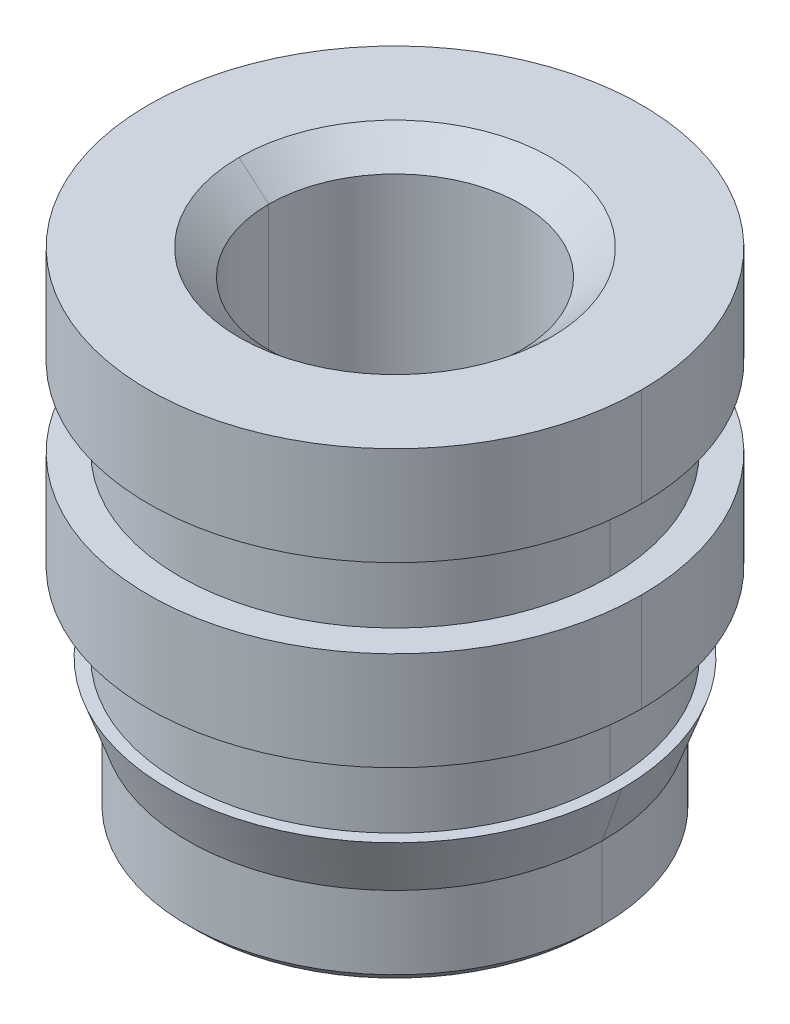
ISO-10303-21;
HEADER;
FILE_DESCRIPTION(('STEP AP214'),'2;1');
FILE_NAME('part.step','',(''),(''),'','','');
FILE_SCHEMA(('AUTOMOTIVE_DESIGN { 1 0 10303 214 1 1 1 1 }'));
ENDSEC;
DATA;
#1=APPLICATION_CONTEXT('core data for automotive mechanical design processes');
#2=APPLICATION_PROTOCOL_DEFINITION('international standard','automotive_design',2000,#1);
#3=PRODUCT_CONTEXT('',#1,'mechanical');
#4=PRODUCT('Part','Part','',(#3));
#5=PRODUCT_RELATED_PRODUCT_CATEGORY('part','',(#4));
#6=PRODUCT_DEFINITION_FORMATION('','',#4);
#7=PRODUCT_DEFINITION_CONTEXT('part definition',#1,'design');
#8=PRODUCT_DEFINITION('design','',#6,#7);
#9=PRODUCT_DEFINITION_SHAPE('','',#8);
#10=(LENGTH_UNIT() NAMED_UNIT(*) SI_UNIT(.MILLI.,.METRE.));
#11=(NAMED_UNIT(*) PLANE_ANGLE_UNIT() SI_UNIT($,.RADIAN.));
#12=(NAMED_UNIT(*) SI_UNIT($,.STERADIAN.) SOLID_ANGLE_UNIT());
#13=UNCERTAINTY_MEASURE_WITH_UNIT(LENGTH_MEASURE(1.E-05),#10,'distance_accuracy_value','');
#14=(GEOMETRIC_REPRESENTATION_CONTEXT(3) GLOBAL_UNCERTAINTY_ASSIGNED_CONTEXT((#13)) GLOBAL_UNIT_ASSIGNED_CONTEXT((#10,
#11,#12)) REPRESENTATION_CONTEXT('',''));
#15=CARTESIAN_POINT('',(0.,0.,0.));
#16=DIRECTION('',(0.,0.,1.));
#17=DIRECTION('',(1.,0.,0.));
#18=AXIS2_PLACEMENT_3D('',#15,#16,#17);
#19=CARTESIAN_POINT('',(0.,1.4224,0.));
#20=DIRECTION('',(0.,1.,0.));
#21=DIRECTION('',(1.,0.,0.));
#22=AXIS2_PLACEMENT_3D('',#19,#20,#21);
#23=CONICAL_SURFACE('',#22,2.794,0.34302394042182);
#24=CARTESIAN_POINT('',(0.,1.0668,0.));
#25=DIRECTION('',(0.,-1.,0.));
#26=DIRECTION('',(1.,0.,0.));
#27=AXIS2_PLACEMENT_3D('',#24,#25,#26);
#28=CIRCLE('',#27,2.667);
#29=CARTESIAN_POINT('',(-2.667,1.0668,0.));
#30=VERTEX_POINT('',#29);
#31=CARTESIAN_POINT('',(2.667,1.0668,0.));
#32=VERTEX_POINT('',#31);
#33=EDGE_CURVE('E13',#30,#32,#28,.T.);
#34=ORIENTED_EDGE('',*,*,#33,.F.);
#35=DIRECTION('',(-0.336336396999208,0.941741911594462,0.));
#36=VECTOR('',#35,1.);
#37=CARTESIAN_POINT('',(-2.794,1.4224,0.));
#38=LINE('',#37,#36);
#39=CARTESIAN_POINT('',(-2.92100000000045,1.778,0.));
#40=VERTEX_POINT('',#39);
#41=EDGE_CURVE('E33',#30,#40,#38,.T.);
#42=ORIENTED_EDGE('',*,*,#41,.T.);
#43=CARTESIAN_POINT('',(0.,1.778,0.));
#44=DIRECTION('',(0.,-1.,0.));
#45=DIRECTION('',(1.,0.,0.));
#46=AXIS2_PLACEMENT_3D('',#43,#44,#45);
#47=CIRCLE('',#46,2.921);
#48=CARTESIAN_POINT('',(2.92100000000045,1.778,0.));
#49=VERTEX_POINT('',#48);
#50=EDGE_CURVE('E307',#40,#49,#47,.T.);
#51=ORIENTED_EDGE('',*,*,#50,.T.);
#52=DIRECTION('',(0.336336396999207,0.941741911594462,0.));
#53=VECTOR('',#52,1.);
#54=CARTESIAN_POINT('',(2.794,1.4224,0.));
#55=LINE('',#54,#53);
#56=EDGE_CURVE('E303',#32,#49,#55,.T.);
#57=ORIENTED_EDGE('',*,*,#56,.F.);
#58=EDGE_LOOP('',(#34,#42,#51,#57));
#59=FACE_BOUND('',#58,.T.);
#60=ADVANCED_FACE('F25',(#59),#23,.T.);
#61=CARTESIAN_POINT('',(0.,2.286,0.));
#62=DIRECTION('',(0.,-1.,0.));
#63=DIRECTION('',(1.,0.,0.));
#64=AXIS2_PLACEMENT_3D('',#61,#62,#63);
#65=CYLINDRICAL_SURFACE('',#64,2.7686);
#66=CARTESIAN_POINT('',(0.,2.794,0.));
#67=DIRECTION('',(0.,-1.,0.));
#68=DIRECTION('',(1.,0.,0.));
#69=AXIS2_PLACEMENT_3D('',#66,#67,#68);
#70=CIRCLE('',#69,2.7686);
#71=CARTESIAN_POINT('',(2.7686,2.794,0.));
#72=VERTEX_POINT('',#71);
#73=CARTESIAN_POINT('',(-2.7686,2.794,0.));
#74=VERTEX_POINT('',#73);
#75=EDGE_CURVE('E300',#72,#74,#70,.T.);
#76=ORIENTED_EDGE('',*,*,#75,.T.);
#77=DIRECTION('',(0.,-1.,0.));
#78=VECTOR('',#77,1.);
#79=CARTESIAN_POINT('',(-2.7686,2.286,0.));
#80=LINE('',#79,#78);
#81=CARTESIAN_POINT('',(-2.7686,1.778,0.));
#82=VERTEX_POINT('',#81);
#83=EDGE_CURVE('E297',#74,#82,#80,.T.);
#84=ORIENTED_EDGE('',*,*,#83,.T.);
#85=CARTESIAN_POINT('',(0.,1.778,0.));
#86=DIRECTION('',(0.,-1.,0.));
#87=DIRECTION('',(1.,0.,0.));
#88=AXIS2_PLACEMENT_3D('',#85,#86,#87);
#89=CIRCLE('',#88,2.7686);
#90=CARTESIAN_POINT('',(2.7686,1.778,0.));
#91=VERTEX_POINT('',#90);
#92=EDGE_CURVE('E293',#91,#82,#89,.T.);
#93=ORIENTED_EDGE('',*,*,#92,.F.);
#94=DIRECTION('',(0.,-1.,0.));
#95=VECTOR('',#94,1.);
#96=CARTESIAN_POINT('',(2.7686,2.286,0.));
#97=LINE('',#96,#95);
#98=EDGE_CURVE('E289',#72,#91,#97,.T.);
#99=ORIENTED_EDGE('',*,*,#98,.F.);
#100=EDGE_LOOP('',(#76,#84,#93,#99));
#101=FACE_BOUND('',#100,.T.);
#102=ADVANCED_FACE('F383',(#101),#65,.T.);
#103=CARTESIAN_POINT('',(0.,3.429,0.));
#104=DIRECTION('',(0.,-1.,0.));
#105=DIRECTION('',(1.,0.,0.));
#106=AXIS2_PLACEMENT_3D('',#103,#104,#105);
#107=CYLINDRICAL_SURFACE('',#106,3.175);
#108=CARTESIAN_POINT('',(0.,4.064,0.));
#109=DIRECTION('',(0.,-1.,0.));
#110=DIRECTION('',(1.,0.,0.));
#111=AXIS2_PLACEMENT_3D('',#108,#109,#110);
#112=CIRCLE('',#111,3.175);
#113=CARTESIAN_POINT('',(3.175,4.064,0.));
#114=VERTEX_POINT('',#113);
#115=CARTESIAN_POINT('',(-3.175,4.064,0.));
#116=VERTEX_POINT('',#115);
#117=EDGE_CURVE('E286',#114,#116,#112,.T.);
#118=ORIENTED_EDGE('',*,*,#117,.T.);
#119=DIRECTION('',(0.,-1.,0.));
#120=VECTOR('',#119,1.);
#121=CARTESIAN_POINT('',(-3.175,3.429,0.));
#122=LINE('',#121,#120);
#123=CARTESIAN_POINT('',(-3.175,2.794,0.));
#124=VERTEX_POINT('',#123);
#125=EDGE_CURVE('E283',#116,#124,#122,.T.);
#126=ORIENTED_EDGE('',*,*,#125,.T.);
#127=CARTESIAN_POINT('',(0.,2.794,0.));
#128=DIRECTION('',(0.,-1.,0.));
#129=DIRECTION('',(1.,0.,0.));
#130=AXIS2_PLACEMENT_3D('',#127,#128,#129);
#131=CIRCLE('',#130,3.175);
#132=CARTESIAN_POINT('',(3.175,2.794,0.));
#133=VERTEX_POINT('',#132);
#134=EDGE_CURVE('E279',#133,#124,#131,.T.);
#135=ORIENTED_EDGE('',*,*,#134,.F.);
#136=DIRECTION('',(0.,-1.,0.));
#137=VECTOR('',#136,1.);
#138=CARTESIAN_POINT('',(3.175,3.429,0.));
#139=LINE('',#138,#137);
#140=EDGE_CURVE('E275',#114,#133,#139,.T.);
#141=ORIENTED_EDGE('',*,*,#140,.F.);
#142=EDGE_LOOP('',(#118,#126,#135,#141));
#143=FACE_BOUND('',#142,.T.);
#144=ADVANCED_FACE('F387',(#143),#107,.T.);
#145=CARTESIAN_POINT('',(0.,4.572,0.));
#146=DIRECTION('',(0.,-1.,0.));
#147=DIRECTION('',(1.,0.,0.));
#148=AXIS2_PLACEMENT_3D('',#145,#146,#147);
#149=CYLINDRICAL_SURFACE('',#148,2.7686);
#150=CARTESIAN_POINT('',(0.,5.08,0.));
#151=DIRECTION('',(0.,-1.,0.));
#152=DIRECTION('',(1.,0.,0.));
#153=AXIS2_PLACEMENT_3D('',#150,#151,#152);
#154=CIRCLE('',#153,2.7686);
#155=CARTESIAN_POINT('',(2.7686,5.08,0.));
#156=VERTEX_POINT('',#155);
#157=CARTESIAN_POINT('',(-2.7686,5.08,0.));
#158=VERTEX_POINT('',#157);
#159=EDGE_CURVE('E272',#156,#158,#154,.T.);
#160=ORIENTED_EDGE('',*,*,#159,.T.);
#161=DIRECTION('',(0.,-1.,0.));
#162=VECTOR('',#161,1.);
#163=CARTESIAN_POINT('',(-2.7686,4.572,0.));
#164=LINE('',#163,#162);
#165=CARTESIAN_POINT('',(-2.7686,4.064,0.));
#166=VERTEX_POINT('',#165);
#167=EDGE_CURVE('E269',#158,#166,#164,.T.);
#168=ORIENTED_EDGE('',*,*,#167,.T.);
#169=CARTESIAN_POINT('',(0.,4.064,0.));
#170=DIRECTION('',(0.,-1.,0.));
#171=DIRECTION('',(1.,0.,0.));
#172=AXIS2_PLACEMENT_3D('',#169,#170,#171);
#173=CIRCLE('',#172,2.7686);
#174=CARTESIAN_POINT('',(2.7686,4.064,0.));
#175=VERTEX_POINT('',#174);
#176=EDGE_CURVE('E265',#175,#166,#173,.T.);
#177=ORIENTED_EDGE('',*,*,#176,.F.);
#178=DIRECTION('',(0.,-1.,0.));
#179=VECTOR('',#178,1.);
#180=CARTESIAN_POINT('',(2.7686,4.572,0.));
#181=LINE('',#180,#179);
#182=EDGE_CURVE('E261',#156,#175,#181,.T.);
#183=ORIENTED_EDGE('',*,*,#182,.F.);
#184=EDGE_LOOP('',(#160,#168,#177,#183));
#185=FACE_BOUND('',#184,.T.);
#186=ADVANCED_FACE('F392',(#185),#149,.T.);
#187=CARTESIAN_POINT('',(0.,5.715,0.));
#188=DIRECTION('',(0.,-1.,0.));
#189=DIRECTION('',(1.,0.,0.));
#190=AXIS2_PLACEMENT_3D('',#187,#188,#189);
#191=CYLINDRICAL_SURFACE('',#190,3.175);
#192=CARTESIAN_POINT('',(0.,6.35,0.));
#193=DIRECTION('',(0.,-1.,0.));
#194=DIRECTION('',(1.,0.,0.));
#195=AXIS2_PLACEMENT_3D('',#192,#193,#194);
#196=CIRCLE('',#195,3.175);
#197=CARTESIAN_POINT('',(3.175,6.35,0.));
#198=VERTEX_POINT('',#197);
#199=CARTESIAN_POINT('',(-3.175,6.35,0.));
#200=VERTEX_POINT('',#199);
#201=EDGE_CURVE('E258',#198,#200,#196,.T.);
#202=ORIENTED_EDGE('',*,*,#201,.T.);
#203=DIRECTION('',(0.,-1.,0.));
#204=VECTOR('',#203,1.);
#205=CARTESIAN_POINT('',(-3.175,5.715,0.));
#206=LINE('',#205,#204);
#207=CARTESIAN_POINT('',(-3.175,5.08,0.));
#208=VERTEX_POINT('',#207);
#209=EDGE_CURVE('E255',#200,#208,#206,.T.);
#210=ORIENTED_EDGE('',*,*,#209,.T.);
#211=CARTESIAN_POINT('',(0.,5.08,0.));
#212=DIRECTION('',(0.,-1.,0.));
#213=DIRECTION('',(1.,0.,0.));
#214=AXIS2_PLACEMENT_3D('',#211,#212,#213);
#215=CIRCLE('',#214,3.175);
#216=CARTESIAN_POINT('',(3.175,5.08,0.));
#217=VERTEX_POINT('',#216);
#218=EDGE_CURVE('E251',#217,#208,#215,.T.);
#219=ORIENTED_EDGE('',*,*,#218,.F.);
#220=DIRECTION('',(0.,-1.,0.));
#221=VECTOR('',#220,1.);
#222=CARTESIAN_POINT('',(3.175,5.715,0.));
#223=LINE('',#222,#221);
#224=EDGE_CURVE('E247',#198,#217,#223,.T.);
#225=ORIENTED_EDGE('',*,*,#224,.F.);
#226=EDGE_LOOP('',(#202,#210,#219,#225));
#227=FACE_BOUND('',#226,.T.);
#228=ADVANCED_FACE('F398',(#227),#191,.T.);
#229=CARTESIAN_POINT('',(0.,0.5334,0.));
#230=DIRECTION('',(0.,-1.,0.));
#231=DIRECTION('',(1.,0.,0.));
#232=AXIS2_PLACEMENT_3D('',#229,#230,#231);
#233=CYLINDRICAL_SURFACE('',#232,2.667);
#234=CARTESIAN_POINT('',(0.,1.0668,0.));
#235=DIRECTION('',(0.,-1.,0.));
#236=DIRECTION('',(1.,0.,0.));
#237=AXIS2_PLACEMENT_3D('',#234,#235,#236);
#238=CIRCLE('',#237,2.667);
#239=EDGE_CURVE('E243',#32,#30,#238,.T.);
#240=ORIENTED_EDGE('',*,*,#239,.T.);
#241=DIRECTION('',(0.,-1.,0.));
#242=VECTOR('',#241,1.);
#243=CARTESIAN_POINT('',(-2.667,0.533399999999999,0.));
#244=LINE('',#243,#242);
#245=CARTESIAN_POINT('',(-2.66700000000032,0.126999999999999,0.));
#246=VERTEX_POINT('',#245);
#247=EDGE_CURVE('E240',#30,#246,#244,.T.);
#248=ORIENTED_EDGE('',*,*,#247,.T.);
#249=CARTESIAN_POINT('',(0.,0.127,0.));
#250=DIRECTION('',(0.,-1.,0.));
#251=DIRECTION('',(-1.,0.,0.));
#252=AXIS2_PLACEMENT_3D('',#249,#250,#251);
#253=CIRCLE('',#252,2.667);
#254=CARTESIAN_POINT('',(2.66700000000032,0.127000000000001,0.));
#255=VERTEX_POINT('',#254);
#256=EDGE_CURVE('E236',#255,#246,#253,.T.);
#257=ORIENTED_EDGE('',*,*,#256,.F.);
#258=DIRECTION('',(0.,-1.,0.));
#259=VECTOR('',#258,1.);
#260=CARTESIAN_POINT('',(2.667,0.533400000000001,0.));
#261=LINE('',#260,#259);
#262=EDGE_CURVE('E233',#32,#255,#261,.T.);
#263=ORIENTED_EDGE('',*,*,#262,.F.);
#264=EDGE_LOOP('',(#240,#248,#257,#263));
#265=FACE_BOUND('',#264,.T.);
#266=ADVANCED_FACE('F402',(#265),#233,.T.);
#267=CARTESIAN_POINT('',(0.,0.0635,0.));
#268=DIRECTION('',(0.,1.,0.));
#269=DIRECTION('',(-1.,0.,0.));
#270=AXIS2_PLACEMENT_3D('',#267,#268,#269);
#271=CONICAL_SURFACE('',#270,2.6035,0.785398163399993);
#272=CARTESIAN_POINT('',(0.,0.,0.));
#273=DIRECTION('',(0.,1.,0.));
#274=DIRECTION('',(-1.,0.,0.));
#275=AXIS2_PLACEMENT_3D('',#272,#273,#274);
#276=CIRCLE('',#275,2.54);
#277=CARTESIAN_POINT('',(-2.54,0.,0.));
#278=VERTEX_POINT('',#277);
#279=CARTESIAN_POINT('',(2.54,0.,0.));
#280=VERTEX_POINT('',#279);
#281=EDGE_CURVE('E230',#278,#280,#276,.T.);
#282=ORIENTED_EDGE('',*,*,#281,.T.);
#283=DIRECTION('',(0.707106781188347,0.707106781184748,0.));
#284=VECTOR('',#283,1.);
#285=CARTESIAN_POINT('',(2.6035,0.0635000000000007,0.));
#286=LINE('',#285,#284);
#287=EDGE_CURVE('E227',#280,#255,#286,.T.);
#288=ORIENTED_EDGE('',*,*,#287,.T.);
#289=ORIENTED_EDGE('',*,*,#256,.T.);
#290=DIRECTION('',(-0.707106781188347,0.707106781184748,0.));
#291=VECTOR('',#290,1.);
#292=CARTESIAN_POINT('',(-2.6035,0.0634999999999993,0.));
#293=LINE('',#292,#291);
#294=EDGE_CURVE('E224',#278,#246,#293,.T.);
#295=ORIENTED_EDGE('',*,*,#294,.F.);
#296=EDGE_LOOP('',(#282,#288,#289,#295));
#297=FACE_BOUND('',#296,.T.);
#298=ADVANCED_FACE('F380',(#297),#271,.T.);
#299=CARTESIAN_POINT('',(0.,6.184400876446,0.));
#300=DIRECTION('',(0.,1.,0.));
#301=DIRECTION('',(-1.,0.,0.));
#302=AXIS2_PLACEMENT_3D('',#299,#300,#301);
#303=CONICAL_SURFACE('',#302,1.8161,0.85521133348);
#304=CARTESIAN_POINT('',(0.,6.01880175289203,0.));
#305=DIRECTION('',(0.,-1.,0.));
#306=DIRECTION('',(-1.,0.,0.));
#307=AXIS2_PLACEMENT_3D('',#304,#305,#306);
#308=CIRCLE('',#307,1.6256);
#309=CARTESIAN_POINT('',(-1.6256,6.01880175289203,0.));
#310=VERTEX_POINT('',#309);
#311=CARTESIAN_POINT('',(1.6256,6.01880175289203,0.));
#312=VERTEX_POINT('',#311);
#313=EDGE_CURVE('E220',#310,#312,#308,.T.);
#314=ORIENTED_EDGE('',*,*,#313,.T.);
#315=DIRECTION('',(0.754709580224595,0.65605902898841,0.));
#316=VECTOR('',#315,1.);
#317=CARTESIAN_POINT('',(1.8161,6.184400876446,0.));
#318=LINE('',#317,#316);
#319=CARTESIAN_POINT('',(2.00660000000108,6.35,0.));
#320=VERTEX_POINT('',#319);
#321=EDGE_CURVE('E216',#312,#320,#318,.T.);
#322=ORIENTED_EDGE('',*,*,#321,.T.);
#323=CARTESIAN_POINT('',(0.,6.35,0.));
#324=DIRECTION('',(0.,1.,0.));
#325=DIRECTION('',(-1.,0.,0.));
#326=AXIS2_PLACEMENT_3D('',#323,#324,#325);
#327=CIRCLE('',#326,2.0066);
#328=CARTESIAN_POINT('',(-2.00660000000108,6.35,0.));
#329=VERTEX_POINT('',#328);
#330=EDGE_CURVE('E212',#320,#329,#327,.T.);
#331=ORIENTED_EDGE('',*,*,#330,.T.);
#332=DIRECTION('',(-0.754709580224595,0.65605902898841,0.));
#333=VECTOR('',#332,1.);
#334=CARTESIAN_POINT('',(-1.8161,6.184400876446,0.));
#335=LINE('',#334,#333);
#336=EDGE_CURVE('E209',#310,#329,#335,.T.);
#337=ORIENTED_EDGE('',*,*,#336,.F.);
#338=EDGE_LOOP('',(#314,#322,#331,#337));
#339=FACE_BOUND('',#338,.T.);
#340=ADVANCED_FACE('F365',(#339),#303,.F.);
#341=CARTESIAN_POINT('',(0.,-4.64852262806236,0.));
#342=DIRECTION('',(0.,1.,0.));
#343=DIRECTION('',(1.,0.,0.));
#344=AXIS2_PLACEMENT_3D('',#341,#342,#343);
#345=CYLINDRICAL_SURFACE('',#344,1.6256);
#346=CARTESIAN_POINT('',(0.,0.331198247107983,0.));
#347=DIRECTION('',(0.,1.,0.));
#348=DIRECTION('',(1.,0.,0.));
#349=AXIS2_PLACEMENT_3D('',#346,#347,#348);
#350=CIRCLE('',#349,1.6256);
#351=CARTESIAN_POINT('',(-1.6256,0.331198247107982,0.));
#352=VERTEX_POINT('',#351);
#353=CARTESIAN_POINT('',(1.6256,0.331198247107983,0.));
#354=VERTEX_POINT('',#353);
#355=EDGE_CURVE('E167',#352,#354,#350,.T.);
#356=ORIENTED_EDGE('',*,*,#355,.F.);
#357=DIRECTION('',(0.,1.,0.));
#358=VECTOR('',#357,1.);
#359=CARTESIAN_POINT('',(-1.6256,-4.64852262806236,0.));
#360=LINE('',#359,#358);
#361=EDGE_CURVE('E204',#352,#310,#360,.T.);
#362=ORIENTED_EDGE('',*,*,#361,.T.);
#363=CARTESIAN_POINT('',(0.,6.01880175289203,0.));
#364=DIRECTION('',(0.,-1.,0.));
#365=DIRECTION('',(-1.,0.,0.));
#366=AXIS2_PLACEMENT_3D('',#363,#364,#365);
#367=CIRCLE('',#366,1.6256);
#368=EDGE_CURVE('E200',#312,#310,#367,.T.);
#369=ORIENTED_EDGE('',*,*,#368,.F.);
#370=DIRECTION('',(0.,1.,0.));
#371=VECTOR('',#370,1.);
#372=CARTESIAN_POINT('',(1.6256,-4.64852262806236,0.));
#373=LINE('',#372,#371);
#374=EDGE_CURVE('E196',#354,#312,#373,.T.);
#375=ORIENTED_EDGE('',*,*,#374,.F.);
#376=EDGE_LOOP('',(#356,#362,#369,#375));
#377=FACE_BOUND('',#376,.T.);
#378=ADVANCED_FACE('F371',(#377),#345,.F.);
#379=CARTESIAN_POINT('',(0.,0.165599123553992,0.));
#380=DIRECTION('',(0.,-1.,0.));
#381=DIRECTION('',(1.,0.,0.));
#382=AXIS2_PLACEMENT_3D('',#379,#380,#381);
#383=CONICAL_SURFACE('',#382,1.8161,0.85521133348);
#384=CARTESIAN_POINT('',(0.,0.331198247107983,0.));
#385=DIRECTION('',(0.,1.,0.));
#386=DIRECTION('',(1.,0.,0.));
#387=AXIS2_PLACEMENT_3D('',#384,#385,#386);
#388=CIRCLE('',#387,1.6256);
#389=EDGE_CURVE('E193',#354,#352,#388,.T.);
#390=ORIENTED_EDGE('',*,*,#389,.T.);
#391=DIRECTION('',(-0.754709580224595,-0.65605902898841,0.));
#392=VECTOR('',#391,1.);
#393=CARTESIAN_POINT('',(-1.8161,0.165599123553991,0.));
#394=LINE('',#393,#392);
#395=CARTESIAN_POINT('',(-2.00660000000107,0.,0.));
#396=VERTEX_POINT('',#395);
#397=EDGE_CURVE('E175',#352,#396,#394,.T.);
#398=ORIENTED_EDGE('',*,*,#397,.T.);
#399=CARTESIAN_POINT('',(0.,0.,0.));
#400=DIRECTION('',(0.,-1.,0.));
#401=DIRECTION('',(1.,0.,0.));
#402=AXIS2_PLACEMENT_3D('',#399,#400,#401);
#403=CIRCLE('',#402,2.0066);
#404=CARTESIAN_POINT('',(2.00660000000107,0.,0.));
#405=VERTEX_POINT('',#404);
#406=EDGE_CURVE('E171',#396,#405,#403,.T.);
#407=ORIENTED_EDGE('',*,*,#406,.T.);
#408=DIRECTION('',(0.754709580224595,-0.65605902898841,0.));
#409=VECTOR('',#408,1.);
#410=CARTESIAN_POINT('',(1.8161,0.165599123553992,0.));
#411=LINE('',#410,#409);
#412=EDGE_CURVE('E160',#354,#405,#411,.T.);
#413=ORIENTED_EDGE('',*,*,#412,.F.);
#414=EDGE_LOOP('',(#390,#398,#407,#413));
#415=FACE_BOUND('',#414,.T.);
#416=ADVANCED_FACE('F174',(#415),#383,.F.);
#417=CARTESIAN_POINT('',(0.,0.165599123553992,0.));
#418=DIRECTION('',(0.,-1.,0.));
#419=DIRECTION('',(1.,0.,0.));
#420=AXIS2_PLACEMENT_3D('',#417,#418,#419);
#421=CONICAL_SURFACE('',#420,1.8161,0.85521133348);
#422=ORIENTED_EDGE('',*,*,#397,.F.);
#423=ORIENTED_EDGE('',*,*,#355,.T.);
#424=ORIENTED_EDGE('',*,*,#412,.T.);
#425=CARTESIAN_POINT('',(0.,0.,0.));
#426=DIRECTION('',(0.,-1.,0.));
#427=DIRECTION('',(1.,0.,0.));
#428=AXIS2_PLACEMENT_3D('',#425,#426,#427);
#429=CIRCLE('',#428,2.0066);
#430=EDGE_CURVE('E165',#405,#396,#429,.T.);
#431=ORIENTED_EDGE('',*,*,#430,.T.);
#432=EDGE_LOOP('',(#422,#423,#424,#431));
#433=FACE_BOUND('',#432,.T.);
#434=ADVANCED_FACE('F163',(#433),#421,.F.);
#435=CARTESIAN_POINT('',(0.,-4.64852262806236,0.));
#436=DIRECTION('',(0.,1.,0.));
#437=DIRECTION('',(1.,0.,0.));
#438=AXIS2_PLACEMENT_3D('',#435,#436,#437);
#439=CYLINDRICAL_SURFACE('',#438,1.6256);
#440=ORIENTED_EDGE('',*,*,#361,.F.);
#441=ORIENTED_EDGE('',*,*,#389,.F.);
#442=ORIENTED_EDGE('',*,*,#374,.T.);
#443=ORIENTED_EDGE('',*,*,#313,.F.);
#444=EDGE_LOOP('',(#440,#441,#442,#443));
#445=FACE_BOUND('',#444,.T.);
#446=ADVANCED_FACE('F369',(#445),#439,.F.);
#447=CARTESIAN_POINT('',(1.3335,0.,0.));
#448=DIRECTION('',(0.,-1.,0.));
#449=DIRECTION('',(0.,0.,-1.));
#450=AXIS2_PLACEMENT_3D('',#447,#448,#449);
#451=PLANE('',#450);
#452=ORIENTED_EDGE('',*,*,#281,.F.);
#453=CARTESIAN_POINT('',(0.,0.,0.));
#454=DIRECTION('',(0.,1.,0.));
#455=DIRECTION('',(-1.,0.,0.));
#456=AXIS2_PLACEMENT_3D('',#453,#454,#455);
#457=CIRCLE('',#456,2.54);
#458=EDGE_CURVE('E181',#280,#278,#457,.T.);
#459=ORIENTED_EDGE('',*,*,#458,.F.);
#460=EDGE_LOOP('',(#452,#459));
#461=FACE_BOUND('',#460,.T.);
#462=ORIENTED_EDGE('',*,*,#430,.F.);
#463=ORIENTED_EDGE('',*,*,#406,.F.);
#464=EDGE_LOOP('',(#462,#463));
#465=FACE_BOUND('',#464,.T.);
#466=ADVANCED_FACE('F179',(#461,#465),#451,.T.);
#467=CARTESIAN_POINT('',(0.,6.184400876446,0.));
#468=DIRECTION('',(0.,1.,0.));
#469=DIRECTION('',(-1.,0.,0.));
#470=AXIS2_PLACEMENT_3D('',#467,#468,#469);
#471=CONICAL_SURFACE('',#470,1.8161,0.85521133348);
#472=ORIENTED_EDGE('',*,*,#321,.F.);
#473=ORIENTED_EDGE('',*,*,#368,.T.);
#474=ORIENTED_EDGE('',*,*,#336,.T.);
#475=CARTESIAN_POINT('',(0.,6.35,0.));
#476=DIRECTION('',(0.,1.,0.));
#477=DIRECTION('',(-1.,0.,0.));
#478=AXIS2_PLACEMENT_3D('',#475,#476,#477);
#479=CIRCLE('',#478,2.0066);
#480=EDGE_CURVE('E188',#329,#320,#479,.T.);
#481=ORIENTED_EDGE('',*,*,#480,.T.);
#482=EDGE_LOOP('',(#472,#473,#474,#481));
#483=FACE_BOUND('',#482,.T.);
#484=ADVANCED_FACE('F361',(#483),#471,.F.);
#485=CARTESIAN_POINT('',(1.5875,6.35,0.));
#486=DIRECTION('',(0.,1.,0.));
#487=DIRECTION('',(1.,0.,0.));
#488=AXIS2_PLACEMENT_3D('',#485,#486,#487);
#489=PLANE('',#488);
#490=ORIENTED_EDGE('',*,*,#201,.F.);
#491=CARTESIAN_POINT('',(0.,6.35,0.));
#492=DIRECTION('',(0.,-1.,0.));
#493=DIRECTION('',(1.,0.,0.));
#494=AXIS2_PLACEMENT_3D('',#491,#492,#493);
#495=CIRCLE('',#494,3.175);
#496=EDGE_CURVE('E354',#200,#198,#495,.T.);
#497=ORIENTED_EDGE('',*,*,#496,.F.);
#498=EDGE_LOOP('',(#490,#497));
#499=FACE_BOUND('',#498,.T.);
#500=ORIENTED_EDGE('',*,*,#480,.F.);
#501=ORIENTED_EDGE('',*,*,#330,.F.);
#502=EDGE_LOOP('',(#500,#501));
#503=FACE_BOUND('',#502,.T.);
#504=ADVANCED_FACE('F363',(#499,#503),#489,.T.);
#505=CARTESIAN_POINT('',(0.,0.0635,0.));
#506=DIRECTION('',(0.,1.,0.));
#507=DIRECTION('',(-1.,0.,0.));
#508=AXIS2_PLACEMENT_3D('',#505,#506,#507);
#509=CONICAL_SURFACE('',#508,2.6035,0.785398163399993);
#510=ORIENTED_EDGE('',*,*,#287,.F.);
#511=ORIENTED_EDGE('',*,*,#458,.T.);
#512=ORIENTED_EDGE('',*,*,#294,.T.);
#513=CARTESIAN_POINT('',(0.,0.127,0.));
#514=DIRECTION('',(0.,-1.,0.));
#515=DIRECTION('',(-1.,0.,0.));
#516=AXIS2_PLACEMENT_3D('',#513,#514,#515);
#517=CIRCLE('',#516,2.667);
#518=EDGE_CURVE('E350',#246,#255,#517,.T.);
#519=ORIENTED_EDGE('',*,*,#518,.T.);
#520=EDGE_LOOP('',(#510,#511,#512,#519));
#521=FACE_BOUND('',#520,.T.);
#522=ADVANCED_FACE('F416',(#521),#509,.T.);
#523=CARTESIAN_POINT('',(0.,0.5334,0.));
#524=DIRECTION('',(0.,-1.,0.));
#525=DIRECTION('',(1.,0.,0.));
#526=AXIS2_PLACEMENT_3D('',#523,#524,#525);
#527=CYLINDRICAL_SURFACE('',#526,2.667);
#528=ORIENTED_EDGE('',*,*,#247,.F.);
#529=ORIENTED_EDGE('',*,*,#33,.T.);
#530=ORIENTED_EDGE('',*,*,#262,.T.);
#531=ORIENTED_EDGE('',*,*,#518,.F.);
#532=EDGE_LOOP('',(#528,#529,#530,#531));
#533=FACE_BOUND('',#532,.T.);
#534=ADVANCED_FACE('F469',(#533),#527,.T.);
#535=CARTESIAN_POINT('',(0.,5.715,0.));
#536=DIRECTION('',(0.,-1.,0.));
#537=DIRECTION('',(1.,0.,0.));
#538=AXIS2_PLACEMENT_3D('',#535,#536,#537);
#539=CYLINDRICAL_SURFACE('',#538,3.175);
#540=ORIENTED_EDGE('',*,*,#209,.F.);
#541=ORIENTED_EDGE('',*,*,#496,.T.);
#542=ORIENTED_EDGE('',*,*,#224,.T.);
#543=CARTESIAN_POINT('',(0.,5.08,0.));
#544=DIRECTION('',(0.,-1.,0.));
#545=DIRECTION('',(1.,0.,0.));
#546=AXIS2_PLACEMENT_3D('',#543,#544,#545);
#547=CIRCLE('',#546,3.175);
#548=EDGE_CURVE('E346',#208,#217,#547,.T.);
#549=ORIENTED_EDGE('',*,*,#548,.F.);
#550=EDGE_LOOP('',(#540,#541,#542,#549));
#551=FACE_BOUND('',#550,.T.);
#552=ADVANCED_FACE('F478',(#551),#539,.T.);
#553=CARTESIAN_POINT('',(2.9718,5.08,0.));
#554=DIRECTION('',(0.,-1.,0.));
#555=DIRECTION('',(0.,0.,-1.));
#556=AXIS2_PLACEMENT_3D('',#553,#554,#555);
#557=PLANE('',#556);
#558=ORIENTED_EDGE('',*,*,#218,.T.);
#559=ORIENTED_EDGE('',*,*,#548,.T.);
#560=EDGE_LOOP('',(#558,#559));
#561=FACE_BOUND('',#560,.T.);
#562=ORIENTED_EDGE('',*,*,#159,.F.);
#563=CARTESIAN_POINT('',(0.,5.08,0.));
#564=DIRECTION('',(0.,-1.,0.));
#565=DIRECTION('',(1.,0.,0.));
#566=AXIS2_PLACEMENT_3D('',#563,#564,#565);
#567=CIRCLE('',#566,2.7686);
#568=EDGE_CURVE('E342',#158,#156,#567,.T.);
#569=ORIENTED_EDGE('',*,*,#568,.F.);
#570=EDGE_LOOP('',(#562,#569));
#571=FACE_BOUND('',#570,.T.);
#572=ADVANCED_FACE('F487',(#561,#571),#557,.T.);
#573=CARTESIAN_POINT('',(0.,4.572,0.));
#574=DIRECTION('',(0.,-1.,0.));
#575=DIRECTION('',(1.,0.,0.));
#576=AXIS2_PLACEMENT_3D('',#573,#574,#575);
#577=CYLINDRICAL_SURFACE('',#576,2.7686);
#578=ORIENTED_EDGE('',*,*,#167,.F.);
#579=ORIENTED_EDGE('',*,*,#568,.T.);
#580=ORIENTED_EDGE('',*,*,#182,.T.);
#581=CARTESIAN_POINT('',(0.,4.064,0.));
#582=DIRECTION('',(0.,-1.,0.));
#583=DIRECTION('',(1.,0.,0.));
#584=AXIS2_PLACEMENT_3D('',#581,#582,#583);
#585=CIRCLE('',#584,2.7686);
#586=EDGE_CURVE('E338',#166,#175,#585,.T.);
#587=ORIENTED_EDGE('',*,*,#586,.F.);
#588=EDGE_LOOP('',(#578,#579,#580,#587));
#589=FACE_BOUND('',#588,.T.);
#590=ADVANCED_FACE('F497',(#589),#577,.T.);
#591=CARTESIAN_POINT('',(2.9718,4.064,0.));
#592=DIRECTION('',(0.,1.,0.));
#593=DIRECTION('',(1.,0.,0.));
#594=AXIS2_PLACEMENT_3D('',#591,#592,#593);
#595=PLANE('',#594);
#596=ORIENTED_EDGE('',*,*,#117,.F.);
#597=CARTESIAN_POINT('',(0.,4.064,0.));
#598=DIRECTION('',(0.,-1.,0.));
#599=DIRECTION('',(1.,0.,0.));
#600=AXIS2_PLACEMENT_3D('',#597,#598,#599);
#601=CIRCLE('',#600,3.175);
#602=EDGE_CURVE('E334',#116,#114,#601,.T.);
#603=ORIENTED_EDGE('',*,*,#602,.F.);
#604=EDGE_LOOP('',(#596,#603));
#605=FACE_BOUND('',#604,.T.);
#606=ORIENTED_EDGE('',*,*,#176,.T.);
#607=ORIENTED_EDGE('',*,*,#586,.T.);
#608=EDGE_LOOP('',(#606,#607));
#609=FACE_BOUND('',#608,.T.);
#610=ADVANCED_FACE('F507',(#605,#609),#595,.T.);
#611=CARTESIAN_POINT('',(0.,3.429,0.));
#612=DIRECTION('',(0.,-1.,0.));
#613=DIRECTION('',(1.,0.,0.));
#614=AXIS2_PLACEMENT_3D('',#611,#612,#613);
#615=CYLINDRICAL_SURFACE('',#614,3.175);
#616=ORIENTED_EDGE('',*,*,#125,.F.);
#617=ORIENTED_EDGE('',*,*,#602,.T.);
#618=ORIENTED_EDGE('',*,*,#140,.T.);
#619=CARTESIAN_POINT('',(0.,2.794,0.));
#620=DIRECTION('',(0.,-1.,0.));
#621=DIRECTION('',(1.,0.,0.));
#622=AXIS2_PLACEMENT_3D('',#619,#620,#621);
#623=CIRCLE('',#622,3.175);
#624=EDGE_CURVE('E330',#124,#133,#623,.T.);
#625=ORIENTED_EDGE('',*,*,#624,.F.);
#626=EDGE_LOOP('',(#616,#617,#618,#625));
#627=FACE_BOUND('',#626,.T.);
#628=ADVANCED_FACE('F517',(#627),#615,.T.);
#629=CARTESIAN_POINT('',(2.9718,2.794,0.));
#630=DIRECTION('',(0.,-1.,0.));
#631=DIRECTION('',(0.,0.,-1.));
#632=AXIS2_PLACEMENT_3D('',#629,#630,#631);
#633=PLANE('',#632);
#634=ORIENTED_EDGE('',*,*,#134,.T.);
#635=ORIENTED_EDGE('',*,*,#624,.T.);
#636=EDGE_LOOP('',(#634,#635));
#637=FACE_BOUND('',#636,.T.);
#638=ORIENTED_EDGE('',*,*,#75,.F.);
#639=CARTESIAN_POINT('',(0.,2.794,0.));
#640=DIRECTION('',(0.,-1.,0.));
#641=DIRECTION('',(1.,0.,0.));
#642=AXIS2_PLACEMENT_3D('',#639,#640,#641);
#643=CIRCLE('',#642,2.7686);
#644=EDGE_CURVE('E324',#74,#72,#643,.T.);
#645=ORIENTED_EDGE('',*,*,#644,.F.);
#646=EDGE_LOOP('',(#638,#645));
#647=FACE_BOUND('',#646,.T.);
#648=ADVANCED_FACE('F527',(#637,#647),#633,.T.);
#649=CARTESIAN_POINT('',(0.,2.286,0.));
#650=DIRECTION('',(0.,-1.,0.));
#651=DIRECTION('',(1.,0.,0.));
#652=AXIS2_PLACEMENT_3D('',#649,#650,#651);
#653=CYLINDRICAL_SURFACE('',#652,2.7686);
#654=ORIENTED_EDGE('',*,*,#83,.F.);
#655=ORIENTED_EDGE('',*,*,#644,.T.);
#656=ORIENTED_EDGE('',*,*,#98,.T.);
#657=CARTESIAN_POINT('',(0.,1.778,0.));
#658=DIRECTION('',(0.,-1.,0.));
#659=DIRECTION('',(1.,0.,0.));
#660=AXIS2_PLACEMENT_3D('',#657,#658,#659);
#661=CIRCLE('',#660,2.7686);
#662=EDGE_CURVE('E320',#82,#91,#661,.T.);
#663=ORIENTED_EDGE('',*,*,#662,.F.);
#664=EDGE_LOOP('',(#654,#655,#656,#663));
#665=FACE_BOUND('',#664,.T.);
#666=ADVANCED_FACE('F537',(#665),#653,.T.);
#667=CARTESIAN_POINT('',(2.8448,1.778,0.));
#668=DIRECTION('',(0.,1.,0.));
#669=DIRECTION('',(1.,0.,0.));
#670=AXIS2_PLACEMENT_3D('',#667,#668,#669);
#671=PLANE('',#670);
#672=CARTESIAN_POINT('',(0.,1.778,0.));
#673=DIRECTION('',(0.,-1.,0.));
#674=DIRECTION('',(1.,0.,0.));
#675=AXIS2_PLACEMENT_3D('',#672,#673,#674);
#676=CIRCLE('',#675,2.921);
#677=EDGE_CURVE('E317',#49,#40,#676,.T.);
#678=ORIENTED_EDGE('',*,*,#677,.F.);
#679=ORIENTED_EDGE('',*,*,#50,.F.);
#680=EDGE_LOOP('',(#678,#679));
#681=FACE_BOUND('',#680,.T.);
#682=ORIENTED_EDGE('',*,*,#92,.T.);
#683=ORIENTED_EDGE('',*,*,#662,.T.);
#684=EDGE_LOOP('',(#682,#683));
#685=FACE_BOUND('',#684,.T.);
#686=ADVANCED_FACE('F315',(#681,#685),#671,.T.);
#687=CARTESIAN_POINT('',(0.,1.4224,0.));
#688=DIRECTION('',(0.,1.,0.));
#689=DIRECTION('',(1.,0.,0.));
#690=AXIS2_PLACEMENT_3D('',#687,#688,#689);
#691=CONICAL_SURFACE('',#690,2.794,0.34302394042182);
#692=ORIENTED_EDGE('',*,*,#41,.F.);
#693=ORIENTED_EDGE('',*,*,#239,.F.);
#694=ORIENTED_EDGE('',*,*,#56,.T.);
#695=ORIENTED_EDGE('',*,*,#677,.T.);
#696=EDGE_LOOP('',(#692,#693,#694,#695));
#697=FACE_BOUND('',#696,.T.);
#698=ADVANCED_FACE('F318',(#697),#691,.T.);
#699=CLOSED_SHELL('',(#60,#102,#144,#186,#228,#266,#298,#340,#378,#416,#434,#446,#466,#484,#504,
#522,#534,#552,#572,#590,#610,#628,#648,#666,#686,#698));
#700=MANIFOLD_SOLID_BREP('B1',#699);
#701=ADVANCED_BREP_SHAPE_REPRESENTATION('',(#18,#700),#14);
#702=SHAPE_DEFINITION_REPRESENTATION(#9,#701);
ENDSEC;
END-ISO-10303-21;
